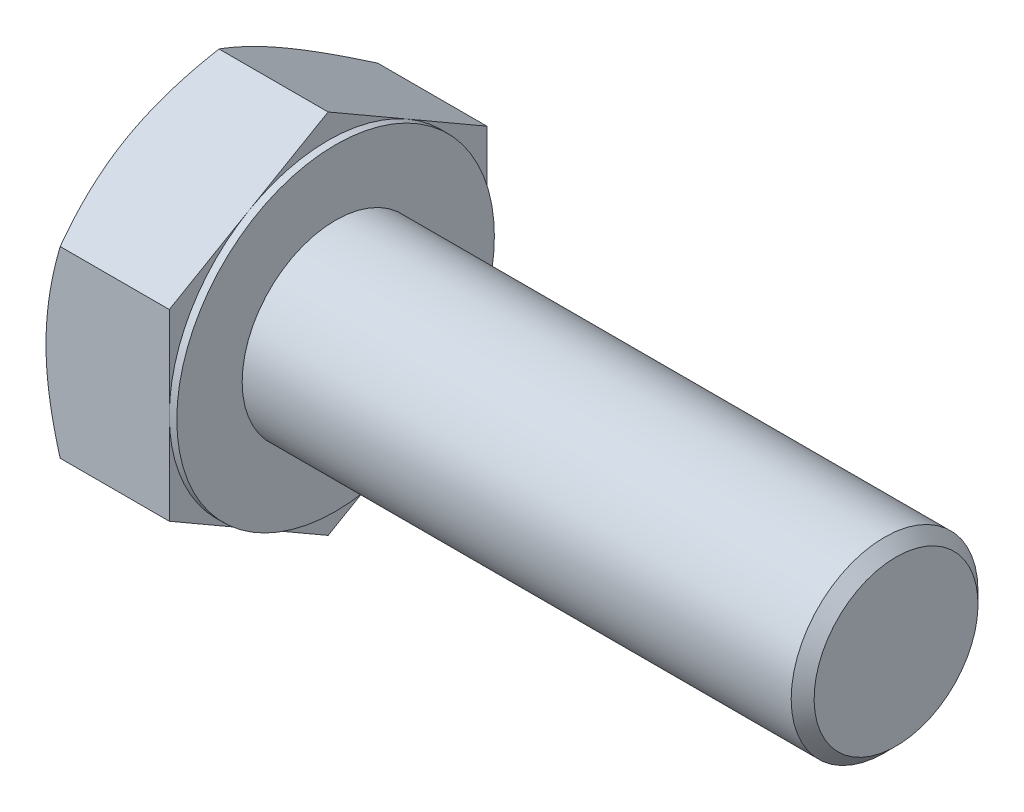
ISO-10303-21;
HEADER;
FILE_DESCRIPTION(('STEP AP214'),'2;1');
FILE_NAME('part.step','',(''),(''),'','','');
FILE_SCHEMA(('AUTOMOTIVE_DESIGN { 1 0 10303 214 1 1 1 1 }'));
ENDSEC;
DATA;
#1=APPLICATION_CONTEXT('core data for automotive mechanical design processes');
#2=APPLICATION_PROTOCOL_DEFINITION('international standard','automotive_design',2000,#1);
#3=PRODUCT_CONTEXT('',#1,'mechanical');
#4=PRODUCT('Part','Part','',(#3));
#5=PRODUCT_RELATED_PRODUCT_CATEGORY('part','',(#4));
#6=PRODUCT_DEFINITION_FORMATION('','',#4);
#7=PRODUCT_DEFINITION_CONTEXT('part definition',#1,'design');
#8=PRODUCT_DEFINITION('design','',#6,#7);
#9=PRODUCT_DEFINITION_SHAPE('','',#8);
#10=(LENGTH_UNIT() NAMED_UNIT(*) SI_UNIT(.MILLI.,.METRE.));
#11=(NAMED_UNIT(*) PLANE_ANGLE_UNIT() SI_UNIT($,.RADIAN.));
#12=(NAMED_UNIT(*) SI_UNIT($,.STERADIAN.) SOLID_ANGLE_UNIT());
#13=UNCERTAINTY_MEASURE_WITH_UNIT(LENGTH_MEASURE(1.E-05),#10,'distance_accuracy_value','');
#14=(GEOMETRIC_REPRESENTATION_CONTEXT(3) GLOBAL_UNCERTAINTY_ASSIGNED_CONTEXT((#13)) GLOBAL_UNIT_ASSIGNED_CONTEXT((#10,
#11,#12)) REPRESENTATION_CONTEXT('',''));
#15=CARTESIAN_POINT('',(0.,0.,0.));
#16=DIRECTION('',(0.,0.,1.));
#17=DIRECTION('',(1.,0.,0.));
#18=AXIS2_PLACEMENT_3D('',#15,#16,#17);
#19=CARTESIAN_POINT('',(-7.0001,4.90747728811181,-8.49999999999999));
#20=DIRECTION('',(0.,-0.866025403784439,0.5));
#21=DIRECTION('',(0.,-0.5,-0.866025403784439));
#22=AXIS2_PLACEMENT_3D('',#19,#20,#21);
#23=PLANE('',#22);
#24=CARTESIAN_POINT('',(-6.24084395360205,9.81507004627747,0.000200000000009634));
#25=CARTESIAN_POINT('',(-6.30311386075109,9.70719836791433,-0.186639227622682));
#26=CARTESIAN_POINT('',(-6.36255770425268,9.59892450580105,-0.374175057934588));
#27=CARTESIAN_POINT('',(-6.47501488923976,9.38149745632219,-0.750769754571753));
#28=CARTESIAN_POINT('',(-6.52802545501693,9.27234391091496,-0.939829241043357));
#29=CARTESIAN_POINT('',(-6.67636661026956,8.94313560188252,-1.51003475856139));
#30=CARTESIAN_POINT('',(-6.76074107206224,8.72178130831638,-1.89343164149145));
#31=CARTESIAN_POINT('',(-6.85967998430527,8.39052888726991,-2.46717766487415));
#32=CARTESIAN_POINT('',(-6.88786480055182,8.28162036184634,-2.65581276428517));
#33=CARTESIAN_POINT('',(-6.93512591523382,8.06331079760517,-3.0339360213291));
#34=CARTESIAN_POINT('',(-6.95420301844706,7.95390980316587,-3.22342410209653));
#35=CARTESIAN_POINT('',(-6.98276522733422,7.73491944569821,-3.60272652759819));
#36=CARTESIAN_POINT('',(-6.99226121852869,7.62533043846203,-3.79254025608228));
#37=CARTESIAN_POINT('',(-7.00145762036097,7.40605119052156,-4.17234305456067));
#38=CARTESIAN_POINT('',(-7.00115833363276,7.29636095304957,-4.36233211895646));
#39=CARTESIAN_POINT('',(-6.99144552442651,7.09129139581006,-4.71752301118093));
#40=CARTESIAN_POINT('',(-6.98321683140246,6.99589760406283,-4.88274990521379));
#41=CARTESIAN_POINT('',(-6.95951075894311,6.80533344342285,-5.21281671354394));
#42=CARTESIAN_POINT('',(-6.94403289088122,6.71016309002551,-5.37765660100243));
#43=CARTESIAN_POINT('',(-6.88709137914138,6.42502047322659,-5.8715381007013));
#44=CARTESIAN_POINT('',(-6.83512693872241,6.23555293555804,-6.1997055023282));
#45=CARTESIAN_POINT('',(-6.70521505947707,5.85460803351889,-6.85952142754435));
#46=CARTESIAN_POINT('',(-6.62671693012798,5.66317928714412,-7.19108574229467));
#47=CARTESIAN_POINT('',(-6.44855866002739,5.28317649029221,-7.84926989346046));
#48=CARTESIAN_POINT('',(-6.34894036387004,5.09459757358649,-8.17589815843107));
#49=CARTESIAN_POINT('',(-6.24084395360205,4.90736181805798,-8.50019999999999));
#50=B_SPLINE_CURVE_WITH_KNOTS('',3,(#24,#25,#26,#27,#28,#29,#30,#31,#32,#33,#34,#35,#36,#37,#38,
#39,#40,#41,#42,#43,#44,#45,#46,#47,#48,#49),.UNSPECIFIED.,.F.,.F.,(4,2,2,2,2,2,2,2,2,2,2,2,4),
(0.,0.673596396411508,1.34748239783841,2.69805431639326,3.356799954547,4.01548737369113,
4.67342558367775,5.33134346608655,5.90409556798839,6.47688628148363,7.62328361419564,
8.79510569878586,9.9646274374873),.UNSPECIFIED.);
#51=CARTESIAN_POINT('',(-6.24091062144518,9.81495457622362,0.));
#52=VERTEX_POINT('',#51);
#53=CARTESIAN_POINT('',(-7.00010000000001,7.36121593216773,-4.25));
#54=VERTEX_POINT('',#53);
#55=EDGE_CURVE('E196',#52,#54,#50,.T.);
#56=ORIENTED_EDGE('',*,*,#55,.F.);
#57=DIRECTION('',(1.,0.,0.));
#58=VECTOR('',#57,1.);
#59=CARTESIAN_POINT('',(-7.0001,9.81495457622363,0.));
#60=LINE('',#59,#58);
#61=CARTESIAN_POINT('',(-0.400099999999995,9.81495457622363,0.));
#62=VERTEX_POINT('',#61);
#63=EDGE_CURVE('E146',#52,#62,#60,.T.);
#64=ORIENTED_EDGE('',*,*,#63,.T.);
#65=DIRECTION('',(0.,-0.5,-0.866025403784439));
#66=VECTOR('',#65,1.);
#67=CARTESIAN_POINT('',(-0.400099999999995,4.90747728811182,-8.49999999999999));
#68=LINE('',#67,#66);
#69=CARTESIAN_POINT('',(-0.400099999999995,7.36121593216772,-4.24999999999999));
#70=VERTEX_POINT('',#69);
#71=EDGE_CURVE('E217',#62,#70,#68,.T.);
#72=ORIENTED_EDGE('',*,*,#71,.T.);
#73=CARTESIAN_POINT('',(-0.400099999999995,4.90747728811182,-8.49999999999999));
#74=VERTEX_POINT('',#73);
#75=EDGE_CURVE('E199',#70,#74,#68,.T.);
#76=ORIENTED_EDGE('',*,*,#75,.T.);
#77=DIRECTION('',(1.,0.,0.));
#78=VECTOR('',#77,1.);
#79=CARTESIAN_POINT('',(-7.0001,4.90747728811181,-8.49999999999999));
#80=LINE('',#79,#78);
#81=CARTESIAN_POINT('',(-6.24091062144518,4.90747728811179,-8.49999999999999));
#82=VERTEX_POINT('',#81);
#83=EDGE_CURVE('E157',#82,#74,#80,.T.);
#84=ORIENTED_EDGE('',*,*,#83,.F.);
#85=EDGE_CURVE('E188',#54,#82,#50,.T.);
#86=ORIENTED_EDGE('',*,*,#85,.F.);
#87=EDGE_LOOP('',(#56,#64,#72,#76,#84,#86));
#88=FACE_BOUND('',#87,.T.);
#89=ADVANCED_FACE('F33',(#88),#23,.F.);
#90=CARTESIAN_POINT('',(-7.00009999999999,-4.90747728811181,-8.5));
#91=DIRECTION('',(0.,0.,1.));
#92=DIRECTION('',(0.,-1.,0.));
#93=AXIS2_PLACEMENT_3D('',#90,#91,#92);
#94=PLANE('',#93);
#95=CARTESIAN_POINT('',(-2.93262300486363,-13.0153529786628,-8.5));
#96=CARTESIAN_POINT('',(-3.11297292393085,-12.6421549060644,-8.5));
#97=CARTESIAN_POINT('',(-3.2915300165645,-12.2680744790209,-8.5));
#98=CARTESIAN_POINT('',(-3.64403406340084,-11.5176718045362,-8.5));
#99=CARTESIAN_POINT('',(-3.81798021940933,-11.1413491825832,-8.5));
#100=CARTESIAN_POINT('',(-4.16115426530687,-10.3839521422907,-8.5));
#101=CARTESIAN_POINT('',(-4.33034945805721,-10.0028628551929,-8.5));
#102=CARTESIAN_POINT('',(-4.6614725084155,-9.23755213458449,-8.5));
#103=CARTESIAN_POINT('',(-4.82340074483627,-8.85333086557478,-8.5));
#104=CARTESIAN_POINT('',(-5.13997985876011,-8.0763749385893,-8.5));
#105=CARTESIAN_POINT('',(-5.29451698670303,-7.68359367328852,-8.5));
#106=CARTESIAN_POINT('',(-5.5914880435533,-6.89339929362187,-8.5));
#107=CARTESIAN_POINT('',(-5.73392062589328,-6.49598566950782,-8.5));
#108=CARTESIAN_POINT('',(-6.00285490664017,-5.69670564809309,-8.5));
#109=CARTESIAN_POINT('',(-6.12939047405581,-5.29485077246574,-8.5));
#110=CARTESIAN_POINT('',(-6.36242334422017,-4.48544256612766,-8.5));
#111=CARTESIAN_POINT('',(-6.4689269837808,-4.07789108143288,-8.5));
#112=CARTESIAN_POINT('',(-6.65671778090545,-3.25674318697803,-8.5));
#113=CARTESIAN_POINT('',(-6.73799822425786,-2.84314519831409,-8.49999999999999));
#114=CARTESIAN_POINT('',(-6.83693170657789,-2.21910871009911,-8.49999999999999));
#115=CARTESIAN_POINT('',(-6.86608048387725,-2.01046436122689,-8.49999999999999));
#116=CARTESIAN_POINT('',(-6.91614211645644,-1.59219744721491,-8.49999999999999));
#117=CARTESIAN_POINT('',(-6.9370557870956,-1.38257498099925,-8.49999999999999));
#118=CARTESIAN_POINT('',(-6.97008439132062,-0.963964945494879,-8.49999999999999));
#119=CARTESIAN_POINT('',(-6.98225396226358,-0.754981704590909,-8.49999999999999));
#120=CARTESIAN_POINT('',(-6.99773002644735,-0.336687410369703,-8.49999999999999));
#121=CARTESIAN_POINT('',(-7.00103663478638,-0.127376361344845,-8.49999999999999));
#122=CARTESIAN_POINT('',(-6.99870798487789,0.291137931747857,-8.49999999999999));
#123=CARTESIAN_POINT('',(-6.99307523614027,0.500341189584642,-8.49999999999999));
#124=CARTESIAN_POINT('',(-6.97300794352095,0.918327949528149,-8.49999999999999));
#125=CARTESIAN_POINT('',(-6.95857296008892,1.12711143015038,-8.49999999999999));
#126=CARTESIAN_POINT('',(-6.91322094418664,1.63313830348668,-8.49999999999999));
#127=CARTESIAN_POINT('',(-6.87789367735377,1.92999290770943,-8.49999999999999));
#128=CARTESIAN_POINT('',(-6.79140555094639,2.52142734676651,-8.49999999999999));
#129=CARTESIAN_POINT('',(-6.7402403696147,2.81600653818417,-8.49999999999999));
#130=CARTESIAN_POINT('',(-6.62389107957287,3.40264712706612,-8.49999999999999));
#131=CARTESIAN_POINT('',(-6.55869371587868,3.69470587048624,-8.49999999999999));
#132=CARTESIAN_POINT('',(-6.41626930989767,4.27581848781992,-8.49999999999999));
#133=CARTESIAN_POINT('',(-6.33904340086441,4.56487264207299,-8.49999999999999));
#134=CARTESIAN_POINT('',(-6.17239077034279,5.14709542099811,-8.49999999999999));
#135=CARTESIAN_POINT('',(-6.08271138145503,5.4401912231866,-8.49999999999999));
#136=CARTESIAN_POINT('',(-5.89449176163007,6.02328479752574,-8.49999999999999));
#137=CARTESIAN_POINT('',(-5.7959576423708,6.31328455427547,-8.49999999999999));
#138=CARTESIAN_POINT('',(-5.59206388074919,6.8890223744947,-8.49999999999999));
#139=CARTESIAN_POINT('',(-5.48674577876908,7.17477523788028,-8.49999999999999));
#140=CARTESIAN_POINT('',(-5.26992800197169,7.74406391871638,-8.49999999999999));
#141=CARTESIAN_POINT('',(-5.15842582877359,8.02759878652404,-8.49999999999999));
#142=CARTESIAN_POINT('',(-5.0444433610989,8.31010360346656,-8.49999999999999));
#143=B_SPLINE_CURVE_WITH_KNOTS('',3,(#95,#96,#97,#98,#99,#100,#101,#102,#103,#104,#105,#106,
#107,#108,#109,#110,#111,#112,#113,#114,#115,#116,#117,#118,#119,#120,#121,#122,#123,#124,#125,
#126,#127,#128,#129,#130,#131,#132,#133,#134,#135,#136,#137,#138,#139,#140,#141,#142),
.UNSPECIFIED.,.F.,.F.,(4,2,2,2,2,2,2,2,2,2,2,2,2,2,2,2,2,2,2,2,2,2,2,4),(0.,1.24349005913108,
2.48719399002341,3.73801513622721,4.98877100355251,6.25488227119651,7.52113420322705,
8.78464087482372,10.0477471795686,11.3111894251916,11.9430642950552,12.5748765871386,
13.2027058429865,13.8305269455361,14.4581718335559,15.0858480663563,15.9821964126191,
16.8787895650969,17.7762333978002,18.6735927301015,19.5929482789992,20.5116740774003,
21.4252286697937,22.3391550678958),.UNSPECIFIED.);
#144=CARTESIAN_POINT('',(-7.00010000000001,0.,-8.5));
#145=VERTEX_POINT('',#144);
#146=EDGE_CURVE('E190',#82,#145,#143,.F.);
#147=ORIENTED_EDGE('',*,*,#146,.F.);
#148=ORIENTED_EDGE('',*,*,#83,.T.);
#149=DIRECTION('',(0.,-1.,0.));
#150=VECTOR('',#149,1.);
#151=CARTESIAN_POINT('',(-0.400099999999994,-4.90747728811181,-8.5));
#152=LINE('',#151,#150);
#153=CARTESIAN_POINT('',(-0.400099999999994,0.,-8.49999999999999));
#154=VERTEX_POINT('',#153);
#155=EDGE_CURVE('E318',#74,#154,#152,.T.);
#156=ORIENTED_EDGE('',*,*,#155,.T.);
#157=CARTESIAN_POINT('',(-0.400099999999994,-4.90747728811181,-8.5));
#158=VERTEX_POINT('',#157);
#159=EDGE_CURVE('E322',#154,#158,#152,.T.);
#160=ORIENTED_EDGE('',*,*,#159,.T.);
#161=DIRECTION('',(1.,0.,0.));
#162=VECTOR('',#161,1.);
#163=CARTESIAN_POINT('',(-7.00009999999999,-4.90747728811181,-8.5));
#164=LINE('',#163,#162);
#165=CARTESIAN_POINT('',(-6.24091062144518,-4.90747728811183,-8.49999999999997));
#166=VERTEX_POINT('',#165);
#167=EDGE_CURVE('E155',#166,#158,#164,.T.);
#168=ORIENTED_EDGE('',*,*,#167,.F.);
#169=EDGE_CURVE('E204',#145,#166,#143,.F.);
#170=ORIENTED_EDGE('',*,*,#169,.F.);
#171=EDGE_LOOP('',(#147,#148,#156,#160,#168,#170));
#172=FACE_BOUND('',#171,.T.);
#173=ADVANCED_FACE('F256',(#172),#94,.F.);
#174=CARTESIAN_POINT('',(-7.00009999999999,-9.81495457622363,0.));
#175=DIRECTION('',(0.,0.866025403784438,0.5));
#176=DIRECTION('',(0.,-0.5,0.866025403784439));
#177=AXIS2_PLACEMENT_3D('',#174,#175,#176);
#178=PLANE('',#177);
#179=CARTESIAN_POINT('',(-6.24084395360205,-4.90736181805797,-8.5002));
#180=CARTESIAN_POINT('',(-6.30311386075109,-5.01523349642112,-8.31336077237731));
#181=CARTESIAN_POINT('',(-6.36255770425268,-5.1235073585344,-8.1258249420654));
#182=CARTESIAN_POINT('',(-6.47501488923976,-5.34093440801325,-7.74923024542823));
#183=CARTESIAN_POINT('',(-6.52802545501693,-5.45008795342048,-7.56017075895663));
#184=CARTESIAN_POINT('',(-6.67636661026956,-5.77929626245293,-6.9899652414386));
#185=CARTESIAN_POINT('',(-6.76074107206223,-6.00065055601907,-6.60656835850853));
#186=CARTESIAN_POINT('',(-6.85967998430526,-6.33190297706554,-6.03282233512584));
#187=CARTESIAN_POINT('',(-6.88786480055182,-6.44081150248911,-5.84418723571481));
#188=CARTESIAN_POINT('',(-6.93512591523382,-6.65912106673028,-5.46606397867089));
#189=CARTESIAN_POINT('',(-6.95420301844706,-6.76852206116958,-5.27657589790346));
#190=CARTESIAN_POINT('',(-6.98276522733421,-6.98751241863724,-4.8972734724018));
#191=CARTESIAN_POINT('',(-6.99226121852868,-7.09710142587342,-4.70745974391771));
#192=CARTESIAN_POINT('',(-7.00145762036096,-7.31638067381389,-4.32765694543932));
#193=CARTESIAN_POINT('',(-7.00115833363275,-7.42607091128588,-4.13766788104353));
#194=CARTESIAN_POINT('',(-6.99144552442651,-7.63114046852538,-3.78247698881905));
#195=CARTESIAN_POINT('',(-6.98321683140246,-7.72653426027262,-3.6172500947862));
#196=CARTESIAN_POINT('',(-6.95951075894311,-7.91709842091259,-3.28718328645605));
#197=CARTESIAN_POINT('',(-6.94403289088121,-8.01226877430994,-3.12234339899756));
#198=CARTESIAN_POINT('',(-6.88709137914138,-8.29741139110886,-2.62846189929869));
#199=CARTESIAN_POINT('',(-6.83512693872241,-8.48687892877741,-2.30029449767179));
#200=CARTESIAN_POINT('',(-6.70521505947707,-8.86782383081655,-1.64047857245565));
#201=CARTESIAN_POINT('',(-6.62671693012798,-9.05925257719132,-1.30891425770533));
#202=CARTESIAN_POINT('',(-6.44855866002739,-9.43925537404323,-0.650730106539542));
#203=CARTESIAN_POINT('',(-6.34894036387004,-9.62783429074896,-0.324101841568926));
#204=CARTESIAN_POINT('',(-6.24084395360205,-9.81507004627747,0.000199999999995339));
#205=B_SPLINE_CURVE_WITH_KNOTS('',3,(#179,#180,#181,#182,#183,#184,#185,#186,#187,#188,#189,
#190,#191,#192,#193,#194,#195,#196,#197,#198,#199,#200,#201,#202,#203,#204),.UNSPECIFIED.,.F.,
.F.,(4,2,2,2,2,2,2,2,2,2,2,2,4),(0.,0.673596396411509,1.34748239783842,2.69805431639326,
3.356799954547,4.01548737369113,4.67342558367776,5.33134346608655,5.90409556798839,
6.47688628148363,7.62328361419564,8.79510569878585,9.96462743748729),.UNSPECIFIED.);
#206=CARTESIAN_POINT('',(-7.00010000000001,-7.36121593216773,-4.25));
#207=VERTEX_POINT('',#206);
#208=EDGE_CURVE('E251',#166,#207,#205,.T.);
#209=ORIENTED_EDGE('',*,*,#208,.F.);
#210=ORIENTED_EDGE('',*,*,#167,.T.);
#211=DIRECTION('',(0.,-0.5,0.866025403784438));
#212=VECTOR('',#211,1.);
#213=CARTESIAN_POINT('',(-0.400099999999993,-9.81495457622363,0.));
#214=LINE('',#213,#212);
#215=CARTESIAN_POINT('',(-0.400099999999993,-7.36121593216772,-4.25));
#216=VERTEX_POINT('',#215);
#217=EDGE_CURVE('E288',#158,#216,#214,.T.);
#218=ORIENTED_EDGE('',*,*,#217,.T.);
#219=CARTESIAN_POINT('',(-0.400099999999993,-9.81495457622363,0.));
#220=VERTEX_POINT('',#219);
#221=EDGE_CURVE('E317',#216,#220,#214,.T.);
#222=ORIENTED_EDGE('',*,*,#221,.T.);
#223=DIRECTION('',(1.,0.,0.));
#224=VECTOR('',#223,1.);
#225=CARTESIAN_POINT('',(-7.00009999999999,-9.81495457622363,0.));
#226=LINE('',#225,#224);
#227=CARTESIAN_POINT('',(-6.24091062144518,-9.81495457622362,0.));
#228=VERTEX_POINT('',#227);
#229=EDGE_CURVE('E148',#228,#220,#226,.T.);
#230=ORIENTED_EDGE('',*,*,#229,.F.);
#231=EDGE_CURVE('E246',#207,#228,#205,.T.);
#232=ORIENTED_EDGE('',*,*,#231,.F.);
#233=EDGE_LOOP('',(#209,#210,#218,#222,#230,#232));
#234=FACE_BOUND('',#233,.T.);
#235=ADVANCED_FACE('F252',(#234),#178,.F.);
#236=CARTESIAN_POINT('',(-7.00009999999999,-4.90747728811182,8.49999999999999));
#237=DIRECTION('',(0.,0.866025403784439,-0.499999999999999));
#238=DIRECTION('',(0.,0.499999999999999,0.866025403784439));
#239=AXIS2_PLACEMENT_3D('',#236,#237,#238);
#240=PLANE('',#239);
#241=CARTESIAN_POINT('',(-6.24084395360205,-9.81507004627747,-0.000200000000005551));
#242=CARTESIAN_POINT('',(-6.30311386075109,-9.70719836791433,0.186639227622686));
#243=CARTESIAN_POINT('',(-6.36255770425268,-9.59892450580105,0.374175057934591));
#244=CARTESIAN_POINT('',(-6.47501488923976,-9.3814974563222,0.750769754571757));
#245=CARTESIAN_POINT('',(-6.52802545501693,-9.27234391091496,0.939829241043361));
#246=CARTESIAN_POINT('',(-6.67636661026956,-8.94313560188252,1.51003475856139));
#247=CARTESIAN_POINT('',(-6.76074107206223,-8.72178130831638,1.89343164149146));
#248=CARTESIAN_POINT('',(-6.85967998430526,-8.39052888726991,2.46717766487415));
#249=CARTESIAN_POINT('',(-6.88786480055182,-8.28162036184634,2.65581276428518));
#250=CARTESIAN_POINT('',(-6.93512591523382,-8.06331079760517,3.0339360213291));
#251=CARTESIAN_POINT('',(-6.95420301844706,-7.95390980316587,3.22342410209654));
#252=CARTESIAN_POINT('',(-6.98276522733421,-7.73491944569821,3.6027265275982));
#253=CARTESIAN_POINT('',(-6.99226121852868,-7.62533043846203,3.79254025608229));
#254=CARTESIAN_POINT('',(-7.00145762036096,-7.40605119052156,4.17234305456068));
#255=CARTESIAN_POINT('',(-7.00115833363275,-7.29636095304957,4.36233211895646));
#256=CARTESIAN_POINT('',(-6.99144552442651,-7.09129139581006,4.71752301118094));
#257=CARTESIAN_POINT('',(-6.98321683140246,-6.99589760406283,4.88274990521379));
#258=CARTESIAN_POINT('',(-6.95951075894311,-6.80533344342286,5.21281671354394));
#259=CARTESIAN_POINT('',(-6.94403289088121,-6.71016309002551,5.37765660100244));
#260=CARTESIAN_POINT('',(-6.88709137914137,-6.42502047322659,5.87153810070131));
#261=CARTESIAN_POINT('',(-6.83512693872241,-6.23555293555804,6.1997055023282));
#262=CARTESIAN_POINT('',(-6.70521505947707,-5.8546080335189,6.85952142754435));
#263=CARTESIAN_POINT('',(-6.62671693012798,-5.66317928714413,7.19108574229467));
#264=CARTESIAN_POINT('',(-6.44855866002739,-5.28317649029222,7.84926989346046));
#265=CARTESIAN_POINT('',(-6.34894036387004,-5.09459757358649,8.17589815843107));
#266=CARTESIAN_POINT('',(-6.24084395360205,-4.90736181805798,8.50019999999999));
#267=B_SPLINE_CURVE_WITH_KNOTS('',3,(#241,#242,#243,#244,#245,#246,#247,#248,#249,#250,#251,
#252,#253,#254,#255,#256,#257,#258,#259,#260,#261,#262,#263,#264,#265,#266),.UNSPECIFIED.,.F.,
.F.,(4,2,2,2,2,2,2,2,2,2,2,2,4),(0.,0.673596396411508,1.34748239783841,2.69805431639326,
3.356799954547,4.01548737369113,4.67342558367775,5.33134346608655,5.90409556798839,
6.47688628148363,7.62328361419564,8.79510569878585,9.96462743748729),.UNSPECIFIED.);
#268=CARTESIAN_POINT('',(-7.00010000000001,-7.36121593216773,4.24999999999999));
#269=VERTEX_POINT('',#268);
#270=EDGE_CURVE('E56',#228,#269,#267,.T.);
#271=ORIENTED_EDGE('',*,*,#270,.F.);
#272=ORIENTED_EDGE('',*,*,#229,.T.);
#273=DIRECTION('',(0.,0.499999999999999,0.866025403784439));
#274=VECTOR('',#273,1.);
#275=CARTESIAN_POINT('',(-0.400099999999994,-4.90747728811182,8.49999999999999));
#276=LINE('',#275,#274);
#277=CARTESIAN_POINT('',(-0.400099999999993,-7.36121593216773,4.24999999999999));
#278=VERTEX_POINT('',#277);
#279=EDGE_CURVE('E285',#220,#278,#276,.T.);
#280=ORIENTED_EDGE('',*,*,#279,.T.);
#281=CARTESIAN_POINT('',(-0.400099999999994,-4.90747728811182,8.49999999999999));
#282=VERTEX_POINT('',#281);
#283=EDGE_CURVE('E282',#278,#282,#276,.T.);
#284=ORIENTED_EDGE('',*,*,#283,.T.);
#285=DIRECTION('',(1.,0.,0.));
#286=VECTOR('',#285,1.);
#287=CARTESIAN_POINT('',(-7.00009999999999,-4.90747728811182,8.49999999999999));
#288=LINE('',#287,#286);
#289=CARTESIAN_POINT('',(-6.24091062144518,-4.90747728811179,8.49999999999999));
#290=VERTEX_POINT('',#289);
#291=EDGE_CURVE('E145',#290,#282,#288,.T.);
#292=ORIENTED_EDGE('',*,*,#291,.F.);
#293=EDGE_CURVE('E241',#269,#290,#267,.T.);
#294=ORIENTED_EDGE('',*,*,#293,.F.);
#295=EDGE_LOOP('',(#271,#272,#280,#284,#292,#294));
#296=FACE_BOUND('',#295,.T.);
#297=ADVANCED_FACE('F255',(#296),#240,.F.);
#298=CARTESIAN_POINT('',(-7.0001,4.90747728811181,8.5));
#299=DIRECTION('',(0.,0.,-1.));
#300=DIRECTION('',(0.,1.,0.));
#301=AXIS2_PLACEMENT_3D('',#298,#299,#300);
#302=PLANE('',#301);
#303=CARTESIAN_POINT('',(-2.93262300486362,-13.0153529786628,8.49999999999999));
#304=CARTESIAN_POINT('',(-3.11297292393085,-12.6421549060644,8.49999999999999));
#305=CARTESIAN_POINT('',(-3.2915300165645,-12.2680744790209,8.49999999999999));
#306=CARTESIAN_POINT('',(-3.64403406340084,-11.5176718045362,8.49999999999999));
#307=CARTESIAN_POINT('',(-3.81798021940933,-11.1413491825832,8.49999999999999));
#308=CARTESIAN_POINT('',(-4.16115426530687,-10.3839521422907,8.49999999999999));
#309=CARTESIAN_POINT('',(-4.33034945805721,-10.002862855193,8.49999999999999));
#310=CARTESIAN_POINT('',(-4.6614725084155,-9.2375521345845,8.49999999999999));
#311=CARTESIAN_POINT('',(-4.82340074483627,-8.8533308655748,8.49999999999999));
#312=CARTESIAN_POINT('',(-5.13997985876011,-8.07637493858931,8.49999999999999));
#313=CARTESIAN_POINT('',(-5.29451698670303,-7.68359367328853,8.49999999999999));
#314=CARTESIAN_POINT('',(-5.5914880435533,-6.89339929362188,8.49999999999999));
#315=CARTESIAN_POINT('',(-5.73392062589328,-6.49598566950783,8.49999999999999));
#316=CARTESIAN_POINT('',(-6.00285490664017,-5.6967056480931,8.49999999999999));
#317=CARTESIAN_POINT('',(-6.12939047405581,-5.29485077246575,8.49999999999999));
#318=CARTESIAN_POINT('',(-6.36242334422017,-4.48544256612767,8.49999999999999));
#319=CARTESIAN_POINT('',(-6.4689269837808,-4.07789108143288,8.49999999999999));
#320=CARTESIAN_POINT('',(-6.65671778090545,-3.25674318697804,8.49999999999999));
#321=CARTESIAN_POINT('',(-6.73799822425786,-2.84314519831409,8.49999999999999));
#322=CARTESIAN_POINT('',(-6.83693170657789,-2.21910871009912,8.49999999999999));
#323=CARTESIAN_POINT('',(-6.86608048387725,-2.0104643612269,8.49999999999999));
#324=CARTESIAN_POINT('',(-6.91614211645644,-1.59219744721492,8.49999999999999));
#325=CARTESIAN_POINT('',(-6.9370557870956,-1.38257498099926,8.49999999999999));
#326=CARTESIAN_POINT('',(-6.97008439132062,-0.963964945494887,8.49999999999999));
#327=CARTESIAN_POINT('',(-6.98225396226358,-0.754981704590917,8.49999999999999));
#328=CARTESIAN_POINT('',(-6.99773002644735,-0.336687410369711,8.49999999999999));
#329=CARTESIAN_POINT('',(-7.00103663478638,-0.127376361344853,8.49999999999999));
#330=CARTESIAN_POINT('',(-6.99870798487789,0.291137931747848,8.49999999999999));
#331=CARTESIAN_POINT('',(-6.99307523614027,0.500341189584634,8.49999999999999));
#332=CARTESIAN_POINT('',(-6.97300794352095,0.91832794952814,8.49999999999999));
#333=CARTESIAN_POINT('',(-6.95857296008892,1.12711143015037,8.5));
#334=CARTESIAN_POINT('',(-6.91322094418664,1.63313830348667,8.5));
#335=CARTESIAN_POINT('',(-6.87789367735376,1.92999290770942,8.5));
#336=CARTESIAN_POINT('',(-6.79140555094639,2.5214273467665,8.5));
#337=CARTESIAN_POINT('',(-6.7402403696147,2.81600653818416,8.5));
#338=CARTESIAN_POINT('',(-6.62389107957287,3.40264712706611,8.5));
#339=CARTESIAN_POINT('',(-6.55869371587868,3.69470587048623,8.5));
#340=CARTESIAN_POINT('',(-6.41626930989767,4.2758184878199,8.5));
#341=CARTESIAN_POINT('',(-6.33904340086441,4.56487264207298,8.5));
#342=CARTESIAN_POINT('',(-6.17239077034279,5.1470954209981,8.5));
#343=CARTESIAN_POINT('',(-6.08271138145503,5.44019122318659,8.5));
#344=CARTESIAN_POINT('',(-5.89449176163008,6.02328479752573,8.5));
#345=CARTESIAN_POINT('',(-5.7959576423708,6.31328455427546,8.5));
#346=CARTESIAN_POINT('',(-5.59206388074919,6.88902237449468,8.5));
#347=CARTESIAN_POINT('',(-5.48674577876908,7.17477523788027,8.5));
#348=CARTESIAN_POINT('',(-5.26992800197169,7.74406391871637,8.5));
#349=CARTESIAN_POINT('',(-5.15842582877359,8.02759878652402,8.5));
#350=CARTESIAN_POINT('',(-5.0444433610989,8.31010360346655,8.5));
#351=B_SPLINE_CURVE_WITH_KNOTS('',3,(#303,#304,#305,#306,#307,#308,#309,#310,#311,#312,#313,
#314,#315,#316,#317,#318,#319,#320,#321,#322,#323,#324,#325,#326,#327,#328,#329,#330,#331,#332,
#333,#334,#335,#336,#337,#338,#339,#340,#341,#342,#343,#344,#345,#346,#347,#348,#349,#350),
.UNSPECIFIED.,.F.,.F.,(4,2,2,2,2,2,2,2,2,2,2,2,2,2,2,2,2,2,2,2,2,2,2,4),(0.,1.24349005913108,
2.48719399002341,3.73801513622721,4.98877100355251,6.25488227119651,7.52113420322705,
8.78464087482372,10.0477471795687,11.3111894251916,11.9430642950553,12.5748765871386,
13.2027058429865,13.8305269455362,14.4581718335559,15.0858480663563,15.9821964126191,
16.8787895650969,17.7762333978002,18.6735927301015,19.5929482789992,20.5116740774003,
21.4252286697937,22.3391550678958),.UNSPECIFIED.);
#352=CARTESIAN_POINT('',(-7.00010000000001,0.,8.5));
#353=VERTEX_POINT('',#352);
#354=EDGE_CURVE('E48',#290,#353,#351,.T.);
#355=ORIENTED_EDGE('',*,*,#354,.F.);
#356=ORIENTED_EDGE('',*,*,#291,.T.);
#357=DIRECTION('',(0.,1.,0.));
#358=VECTOR('',#357,1.);
#359=CARTESIAN_POINT('',(-0.400099999999995,4.90747728811181,8.5));
#360=LINE('',#359,#358);
#361=CARTESIAN_POINT('',(-0.400099999999994,0.,8.49999999999999));
#362=VERTEX_POINT('',#361);
#363=EDGE_CURVE('E290',#282,#362,#360,.T.);
#364=ORIENTED_EDGE('',*,*,#363,.T.);
#365=CARTESIAN_POINT('',(-0.400099999999995,4.90747728811181,8.5));
#366=VERTEX_POINT('',#365);
#367=EDGE_CURVE('E143',#362,#366,#360,.T.);
#368=ORIENTED_EDGE('',*,*,#367,.T.);
#369=DIRECTION('',(1.,0.,0.));
#370=VECTOR('',#369,1.);
#371=CARTESIAN_POINT('',(-7.0001,4.90747728811181,8.5));
#372=LINE('',#371,#370);
#373=CARTESIAN_POINT('',(-6.24091062144518,4.90747728811182,8.49999999999998));
#374=VERTEX_POINT('',#373);
#375=EDGE_CURVE('E135',#374,#366,#372,.T.);
#376=ORIENTED_EDGE('',*,*,#375,.F.);
#377=EDGE_CURVE('E123',#353,#374,#351,.T.);
#378=ORIENTED_EDGE('',*,*,#377,.F.);
#379=EDGE_LOOP('',(#355,#356,#364,#368,#376,#378));
#380=FACE_BOUND('',#379,.T.);
#381=ADVANCED_FACE('F140',(#380),#302,.F.);
#382=CARTESIAN_POINT('',(-7.0001,9.81495457622363,0.));
#383=DIRECTION('',(0.,-0.866025403784438,-0.500000000000001));
#384=DIRECTION('',(0.,0.500000000000001,-0.866025403784438));
#385=AXIS2_PLACEMENT_3D('',#382,#383,#384);
#386=PLANE('',#385);
#387=CARTESIAN_POINT('',(-6.24084395360205,4.90736181805797,8.5002));
#388=CARTESIAN_POINT('',(-6.30311386075109,5.01523349642111,8.31336077237731));
#389=CARTESIAN_POINT('',(-6.36255770425268,5.12350735853439,8.1258249420654));
#390=CARTESIAN_POINT('',(-6.47501488923976,5.34093440801324,7.74923024542824));
#391=CARTESIAN_POINT('',(-6.52802545501693,5.45008795342048,7.56017075895663));
#392=CARTESIAN_POINT('',(-6.67636661026956,5.77929626245292,6.9899652414386));
#393=CARTESIAN_POINT('',(-6.76074107206223,6.00065055601906,6.60656835850854));
#394=CARTESIAN_POINT('',(-6.85967998430526,6.33190297706554,6.03282233512584));
#395=CARTESIAN_POINT('',(-6.88786480055182,6.4408115024891,5.84418723571482));
#396=CARTESIAN_POINT('',(-6.93512591523382,6.65912106673027,5.46606397867089));
#397=CARTESIAN_POINT('',(-6.95420301844706,6.76852206116957,5.27657589790346));
#398=CARTESIAN_POINT('',(-6.98276522733421,6.98751241863724,4.8972734724018));
#399=CARTESIAN_POINT('',(-6.99226121852868,7.09710142587341,4.70745974391771));
#400=CARTESIAN_POINT('',(-7.00145762036096,7.31638067381389,4.32765694543932));
#401=CARTESIAN_POINT('',(-7.00115833363275,7.42607091128588,4.13766788104354));
#402=CARTESIAN_POINT('',(-6.99144552442651,7.63114046852538,3.78247698881906));
#403=CARTESIAN_POINT('',(-6.98321683140246,7.72653426027262,3.61725009478621));
#404=CARTESIAN_POINT('',(-6.95951075894311,7.91709842091259,3.28718328645605));
#405=CARTESIAN_POINT('',(-6.94403289088121,8.01226877430994,3.12234339899756));
#406=CARTESIAN_POINT('',(-6.88709137914138,8.29741139110886,2.6284618992987));
#407=CARTESIAN_POINT('',(-6.83512693872241,8.48687892877741,2.3002944976718));
#408=CARTESIAN_POINT('',(-6.70521505947707,8.86782383081655,1.64047857245565));
#409=CARTESIAN_POINT('',(-6.62671693012798,9.05925257719132,1.30891425770533));
#410=CARTESIAN_POINT('',(-6.44855866002739,9.43925537404323,0.650730106539547));
#411=CARTESIAN_POINT('',(-6.34894036387004,9.62783429074896,0.324101841568931));
#412=CARTESIAN_POINT('',(-6.24084395360205,9.81507004627747,-0.000199999999989548));
#413=B_SPLINE_CURVE_WITH_KNOTS('',3,(#387,#388,#389,#390,#391,#392,#393,#394,#395,#396,#397,
#398,#399,#400,#401,#402,#403,#404,#405,#406,#407,#408,#409,#410,#411,#412),.UNSPECIFIED.,.F.,
.F.,(4,2,2,2,2,2,2,2,2,2,2,2,4),(0.,0.673596396411507,1.34748239783842,2.69805431639326,
3.356799954547,4.01548737369113,4.67342558367776,5.33134346608655,5.90409556798839,
6.47688628148363,7.62328361419564,8.79510569878585,9.9646274374873),.UNSPECIFIED.);
#414=CARTESIAN_POINT('',(-7.0001,7.36121593216772,4.25));
#415=VERTEX_POINT('',#414);
#416=EDGE_CURVE('E126',#374,#415,#413,.T.);
#417=ORIENTED_EDGE('',*,*,#416,.F.);
#418=ORIENTED_EDGE('',*,*,#375,.T.);
#419=DIRECTION('',(0.,0.500000000000001,-0.866025403784438));
#420=VECTOR('',#419,1.);
#421=CARTESIAN_POINT('',(-0.400099999999995,9.81495457622363,0.));
#422=LINE('',#421,#420);
#423=CARTESIAN_POINT('',(-0.400099999999998,7.36121593216772,4.25000000000001));
#424=VERTEX_POINT('',#423);
#425=EDGE_CURVE('E150',#366,#424,#422,.T.);
#426=ORIENTED_EDGE('',*,*,#425,.T.);
#427=EDGE_CURVE('E292',#424,#62,#422,.T.);
#428=ORIENTED_EDGE('',*,*,#427,.T.);
#429=ORIENTED_EDGE('',*,*,#63,.F.);
#430=EDGE_CURVE('E138',#415,#52,#413,.T.);
#431=ORIENTED_EDGE('',*,*,#430,.F.);
#432=EDGE_LOOP('',(#417,#418,#426,#428,#429,#431));
#433=FACE_BOUND('',#432,.T.);
#434=ADVANCED_FACE('F134',(#433),#386,.F.);
#435=CARTESIAN_POINT('',(30.,0.,0.));
#436=DIRECTION('',(1.,0.,0.));
#437=DIRECTION('',(0.,1.,0.));
#438=AXIS2_PLACEMENT_3D('',#435,#436,#437);
#439=PLANE('',#438);
#440=CARTESIAN_POINT('',(30.,0.,0.));
#441=DIRECTION('',(1.,0.,0.));
#442=DIRECTION('',(0.,1.,0.));
#443=AXIS2_PLACEMENT_3D('',#440,#441,#442);
#444=CIRCLE('',#443,4.38645);
#445=CARTESIAN_POINT('',(30.,4.38645,0.));
#446=VERTEX_POINT('',#445);
#447=EDGE_CURVE('E41',#446,#446,#444,.T.);
#448=ORIENTED_EDGE('',*,*,#447,.T.);
#449=EDGE_LOOP('',(#448));
#450=FACE_BOUND('',#449,.T.);
#451=ADVANCED_FACE('F335',(#450),#439,.T.);
#452=CARTESIAN_POINT('',(30.,0.,0.));
#453=DIRECTION('',(1.,0.,0.));
#454=DIRECTION('',(0.,1.,0.));
#455=AXIS2_PLACEMENT_3D('',#452,#453,#454);
#456=CYLINDRICAL_SURFACE('',#455,5.);
#457=CARTESIAN_POINT('',(29.38655,0.,0.));
#458=DIRECTION('',(1.,0.,0.));
#459=DIRECTION('',(0.,1.,0.));
#460=AXIS2_PLACEMENT_3D('',#457,#458,#459);
#461=CIRCLE('',#460,5.);
#462=CARTESIAN_POINT('',(29.38655,5.,0.));
#463=VERTEX_POINT('',#462);
#464=EDGE_CURVE('E11',#463,#463,#461,.F.);
#465=ORIENTED_EDGE('',*,*,#464,.T.);
#466=EDGE_LOOP('',(#465));
#467=FACE_BOUND('',#466,.T.);
#468=CARTESIAN_POINT('',(0.,0.,0.));
#469=DIRECTION('',(1.,0.,0.));
#470=DIRECTION('',(0.,1.,0.));
#471=AXIS2_PLACEMENT_3D('',#468,#469,#470);
#472=CIRCLE('',#471,5.);
#473=CARTESIAN_POINT('',(0.,4.99999999999999,0.));
#474=VERTEX_POINT('',#473);
#475=EDGE_CURVE('E167',#474,#474,#472,.T.);
#476=ORIENTED_EDGE('',*,*,#475,.T.);
#477=EDGE_LOOP('',(#476));
#478=FACE_BOUND('',#477,.T.);
#479=ADVANCED_FACE('F411',(#467,#478),#456,.T.);
#480=CARTESIAN_POINT('',(0.,5.,0.));
#481=DIRECTION('',(1.,0.,0.));
#482=DIRECTION('',(0.,1.,0.));
#483=AXIS2_PLACEMENT_3D('',#480,#481,#482);
#484=PLANE('',#483);
#485=CARTESIAN_POINT('',(0.,0.,0.));
#486=DIRECTION('',(1.,0.,0.));
#487=DIRECTION('',(0.,1.,0.));
#488=AXIS2_PLACEMENT_3D('',#485,#486,#487);
#489=CIRCLE('',#488,8.5);
#490=CARTESIAN_POINT('',(0.,8.5,0.));
#491=VERTEX_POINT('',#490);
#492=EDGE_CURVE('E163',#491,#491,#489,.T.);
#493=ORIENTED_EDGE('',*,*,#492,.T.);
#494=EDGE_LOOP('',(#493));
#495=FACE_BOUND('',#494,.T.);
#496=ORIENTED_EDGE('',*,*,#475,.F.);
#497=EDGE_LOOP('',(#496));
#498=FACE_BOUND('',#497,.T.);
#499=ADVANCED_FACE('F404',(#495,#498),#484,.T.);
#500=CARTESIAN_POINT('',(30.,0.,0.));
#501=DIRECTION('',(1.,0.,0.));
#502=DIRECTION('',(0.,1.,0.));
#503=AXIS2_PLACEMENT_3D('',#500,#501,#502);
#504=CYLINDRICAL_SURFACE('',#503,8.5);
#505=CARTESIAN_POINT('',(-0.400099999999997,0.,0.));
#506=DIRECTION('',(1.,0.,0.));
#507=DIRECTION('',(0.,1.,0.));
#508=AXIS2_PLACEMENT_3D('',#505,#506,#507);
#509=CIRCLE('',#508,8.5);
#510=EDGE_CURVE('E160',#424,#362,#509,.T.);
#511=ORIENTED_EDGE('',*,*,#510,.T.);
#512=EDGE_CURVE('E164',#362,#278,#509,.T.);
#513=ORIENTED_EDGE('',*,*,#512,.T.);
#514=EDGE_CURVE('E312',#278,#216,#509,.T.);
#515=ORIENTED_EDGE('',*,*,#514,.T.);
#516=EDGE_CURVE('E311',#216,#154,#509,.T.);
#517=ORIENTED_EDGE('',*,*,#516,.T.);
#518=EDGE_CURVE('E310',#154,#70,#509,.T.);
#519=ORIENTED_EDGE('',*,*,#518,.T.);
#520=EDGE_CURVE('E159',#70,#424,#509,.T.);
#521=ORIENTED_EDGE('',*,*,#520,.T.);
#522=EDGE_LOOP('',(#511,#513,#515,#517,#519,#521));
#523=FACE_BOUND('',#522,.T.);
#524=ORIENTED_EDGE('',*,*,#492,.F.);
#525=EDGE_LOOP('',(#524));
#526=FACE_BOUND('',#525,.T.);
#527=ADVANCED_FACE('F307',(#523,#526),#504,.T.);
#528=CARTESIAN_POINT('',(-0.400099999999994,0.,0.));
#529=DIRECTION('',(1.,0.,0.));
#530=DIRECTION('',(0.,1.,0.));
#531=AXIS2_PLACEMENT_3D('',#528,#529,#530);
#532=PLANE('',#531);
#533=ORIENTED_EDGE('',*,*,#510,.F.);
#534=ORIENTED_EDGE('',*,*,#425,.F.);
#535=ORIENTED_EDGE('',*,*,#367,.F.);
#536=EDGE_LOOP('',(#533,#534,#535));
#537=FACE_BOUND('',#536,.T.);
#538=ADVANCED_FACE('F304',(#537),#532,.T.);
#539=ORIENTED_EDGE('',*,*,#512,.F.);
#540=ORIENTED_EDGE('',*,*,#363,.F.);
#541=ORIENTED_EDGE('',*,*,#283,.F.);
#542=EDGE_LOOP('',(#539,#540,#541));
#543=FACE_BOUND('',#542,.T.);
#544=ADVANCED_FACE('F291',(#543),#532,.T.);
#545=ORIENTED_EDGE('',*,*,#514,.F.);
#546=ORIENTED_EDGE('',*,*,#279,.F.);
#547=ORIENTED_EDGE('',*,*,#221,.F.);
#548=EDGE_LOOP('',(#545,#546,#547));
#549=FACE_BOUND('',#548,.T.);
#550=ADVANCED_FACE('F316',(#549),#532,.T.);
#551=ORIENTED_EDGE('',*,*,#516,.F.);
#552=ORIENTED_EDGE('',*,*,#217,.F.);
#553=ORIENTED_EDGE('',*,*,#159,.F.);
#554=EDGE_LOOP('',(#551,#552,#553));
#555=FACE_BOUND('',#554,.T.);
#556=ADVANCED_FACE('F326',(#555),#532,.T.);
#557=ORIENTED_EDGE('',*,*,#518,.F.);
#558=ORIENTED_EDGE('',*,*,#155,.F.);
#559=ORIENTED_EDGE('',*,*,#75,.F.);
#560=EDGE_LOOP('',(#557,#558,#559));
#561=FACE_BOUND('',#560,.T.);
#562=ADVANCED_FACE('F325',(#561),#532,.T.);
#563=ORIENTED_EDGE('',*,*,#520,.F.);
#564=ORIENTED_EDGE('',*,*,#71,.F.);
#565=ORIENTED_EDGE('',*,*,#427,.F.);
#566=EDGE_LOOP('',(#563,#564,#565));
#567=FACE_BOUND('',#566,.T.);
#568=ADVANCED_FACE('F224',(#567),#532,.T.);
#569=CARTESIAN_POINT('',(-7.00010000000001,0.,0.));
#570=DIRECTION('',(1.,0.,0.));
#571=DIRECTION('',(0.,0.,-1.));
#572=AXIS2_PLACEMENT_3D('',#569,#570,#571);
#573=CONICAL_SURFACE('',#572,8.5,1.0471975511966);
#574=ORIENTED_EDGE('',*,*,#55,.T.);
#575=CARTESIAN_POINT('',(-7.0001,0.,0.));
#576=DIRECTION('',(1.,0.,0.));
#577=DIRECTION('',(0.,1.,0.));
#578=AXIS2_PLACEMENT_3D('',#575,#576,#577);
#579=CIRCLE('',#578,8.50000000000003);
#580=EDGE_CURVE('E170',#54,#415,#579,.T.);
#581=ORIENTED_EDGE('',*,*,#580,.T.);
#582=ORIENTED_EDGE('',*,*,#430,.T.);
#583=EDGE_LOOP('',(#574,#581,#582));
#584=FACE_BOUND('',#583,.T.);
#585=ADVANCED_FACE('F197',(#584),#573,.T.);
#586=ORIENTED_EDGE('',*,*,#85,.T.);
#587=ORIENTED_EDGE('',*,*,#146,.T.);
#588=EDGE_CURVE('E172',#145,#54,#579,.T.);
#589=ORIENTED_EDGE('',*,*,#588,.T.);
#590=EDGE_LOOP('',(#586,#587,#589));
#591=FACE_BOUND('',#590,.T.);
#592=ADVANCED_FACE('F186',(#591),#573,.T.);
#593=ORIENTED_EDGE('',*,*,#169,.T.);
#594=ORIENTED_EDGE('',*,*,#208,.T.);
#595=EDGE_CURVE('E179',#207,#145,#579,.T.);
#596=ORIENTED_EDGE('',*,*,#595,.T.);
#597=EDGE_LOOP('',(#593,#594,#596));
#598=FACE_BOUND('',#597,.T.);
#599=ADVANCED_FACE('F269',(#598),#573,.T.);
#600=ORIENTED_EDGE('',*,*,#231,.T.);
#601=ORIENTED_EDGE('',*,*,#270,.T.);
#602=EDGE_CURVE('E177',#269,#207,#579,.T.);
#603=ORIENTED_EDGE('',*,*,#602,.T.);
#604=EDGE_LOOP('',(#600,#601,#603));
#605=FACE_BOUND('',#604,.T.);
#606=ADVANCED_FACE('F274',(#605),#573,.T.);
#607=ORIENTED_EDGE('',*,*,#293,.T.);
#608=ORIENTED_EDGE('',*,*,#354,.T.);
#609=EDGE_CURVE('E173',#353,#269,#579,.T.);
#610=ORIENTED_EDGE('',*,*,#609,.T.);
#611=EDGE_LOOP('',(#607,#608,#610));
#612=FACE_BOUND('',#611,.T.);
#613=ADVANCED_FACE('F279',(#612),#573,.T.);
#614=ORIENTED_EDGE('',*,*,#377,.T.);
#615=ORIENTED_EDGE('',*,*,#416,.T.);
#616=CARTESIAN_POINT('',(-7.00010000000001,0.,0.));
#617=DIRECTION('',(-1.,0.,0.));
#618=DIRECTION('',(0.,0.,1.));
#619=AXIS2_PLACEMENT_3D('',#616,#617,#618);
#620=CIRCLE('',#619,8.5);
#621=EDGE_CURVE('E128',#353,#415,#620,.T.);
#622=ORIENTED_EDGE('',*,*,#621,.F.);
#623=EDGE_LOOP('',(#614,#615,#622));
#624=FACE_BOUND('',#623,.T.);
#625=ADVANCED_FACE('F125',(#624),#573,.T.);
#626=CARTESIAN_POINT('',(-7.0001,0.,0.));
#627=DIRECTION('',(1.,0.,0.));
#628=DIRECTION('',(0.,1.,0.));
#629=AXIS2_PLACEMENT_3D('',#626,#627,#628);
#630=PLANE('',#629);
#631=ORIENTED_EDGE('',*,*,#621,.T.);
#632=ORIENTED_EDGE('',*,*,#580,.F.);
#633=ORIENTED_EDGE('',*,*,#588,.F.);
#634=ORIENTED_EDGE('',*,*,#595,.F.);
#635=ORIENTED_EDGE('',*,*,#602,.F.);
#636=ORIENTED_EDGE('',*,*,#609,.F.);
#637=EDGE_LOOP('',(#631,#632,#633,#634,#635,#636));
#638=FACE_BOUND('',#637,.T.);
#639=ADVANCED_FACE('F201',(#638),#630,.F.);
#640=CARTESIAN_POINT('',(30.,0.,0.));
#641=DIRECTION('',(-1.,0.,0.));
#642=DIRECTION('',(0.,-1.,0.));
#643=AXIS2_PLACEMENT_3D('',#640,#641,#642);
#644=CONICAL_SURFACE('',#643,4.38645,0.785479662989768);
#645=ORIENTED_EDGE('',*,*,#464,.F.);
#646=EDGE_LOOP('',(#645));
#647=FACE_BOUND('',#646,.T.);
#648=ORIENTED_EDGE('',*,*,#447,.F.);
#649=EDGE_LOOP('',(#648));
#650=FACE_BOUND('',#649,.T.);
#651=ADVANCED_FACE('F35',(#647,#650),#644,.T.);
#652=CLOSED_SHELL('',(#89,#173,#235,#297,#381,#434,#451,#479,#499,#527,#538,#544,#550,#556,#562,
#568,#585,#592,#599,#606,#613,#625,#639,#651));
#653=MANIFOLD_SOLID_BREP('B2',#652);
#654=ADVANCED_BREP_SHAPE_REPRESENTATION('',(#18,#653),#14);
#655=SHAPE_DEFINITION_REPRESENTATION(#9,#654);
ENDSEC;
END-ISO-10303-21;
